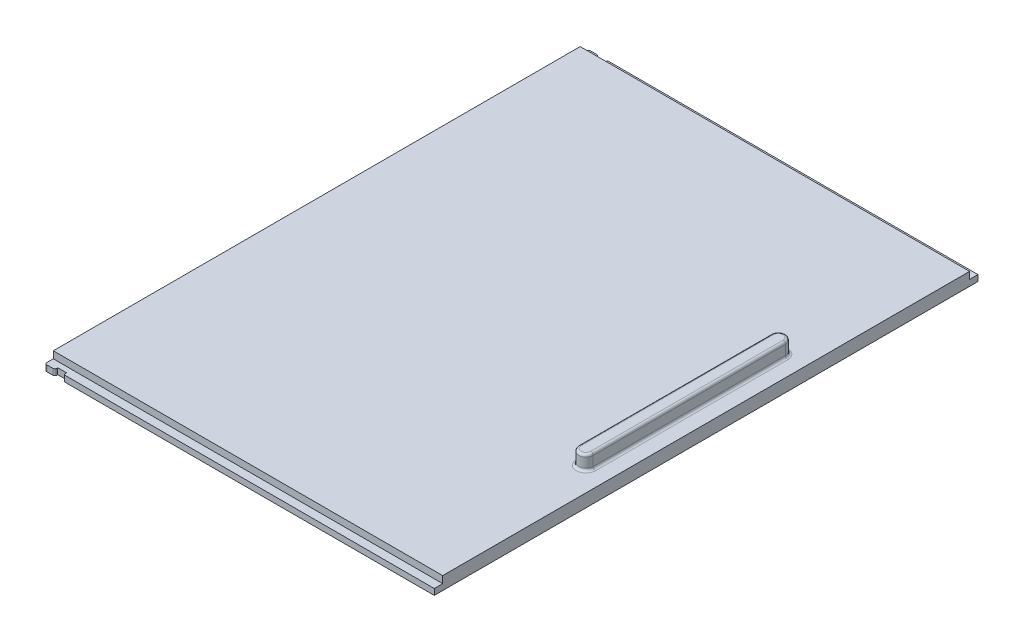
ISO-10303-21;
HEADER;
FILE_DESCRIPTION(('STEP AP214'),'2;1');
FILE_NAME('part.step','',(''),(''),'','','');
FILE_SCHEMA(('AUTOMOTIVE_DESIGN { 1 0 10303 214 1 1 1 1 }'));
ENDSEC;
DATA;
#1=APPLICATION_CONTEXT('core data for automotive mechanical design processes');
#2=APPLICATION_PROTOCOL_DEFINITION('international standard','automotive_design',2000,#1);
#3=PRODUCT_CONTEXT('',#1,'mechanical');
#4=PRODUCT('Part','Part','',(#3));
#5=PRODUCT_RELATED_PRODUCT_CATEGORY('part','',(#4));
#6=PRODUCT_DEFINITION_FORMATION('','',#4);
#7=PRODUCT_DEFINITION_CONTEXT('part definition',#1,'design');
#8=PRODUCT_DEFINITION('design','',#6,#7);
#9=PRODUCT_DEFINITION_SHAPE('','',#8);
#10=(LENGTH_UNIT() NAMED_UNIT(*) SI_UNIT(.MILLI.,.METRE.));
#11=(NAMED_UNIT(*) PLANE_ANGLE_UNIT() SI_UNIT($,.RADIAN.));
#12=(NAMED_UNIT(*) SI_UNIT($,.STERADIAN.) SOLID_ANGLE_UNIT());
#13=UNCERTAINTY_MEASURE_WITH_UNIT(LENGTH_MEASURE(1.E-05),#10,'distance_accuracy_value','');
#14=(GEOMETRIC_REPRESENTATION_CONTEXT(3) GLOBAL_UNCERTAINTY_ASSIGNED_CONTEXT((#13)) GLOBAL_UNIT_ASSIGNED_CONTEXT((#10,
#11,#12)) REPRESENTATION_CONTEXT('',''));
#15=CARTESIAN_POINT('',(0.,0.,0.));
#16=DIRECTION('',(0.,0.,1.));
#17=DIRECTION('',(1.,0.,0.));
#18=AXIS2_PLACEMENT_3D('',#15,#16,#17);
#19=CARTESIAN_POINT('',(0.,3.,0.));
#20=DIRECTION('',(0.,-1.,0.));
#21=DIRECTION('',(0.,0.,-1.));
#22=AXIS2_PLACEMENT_3D('',#19,#20,#21);
#23=PLANE('',#22);
#24=CARTESIAN_POINT('',(76.,3.,-38.));
#25=DIRECTION('',(0.,-1.,0.));
#26=DIRECTION('',(0.,0.,-1.));
#27=AXIS2_PLACEMENT_3D('',#24,#25,#26);
#28=CIRCLE('',#27,2.);
#29=CARTESIAN_POINT('',(78.,3.,-38.));
#30=VERTEX_POINT('',#29);
#31=CARTESIAN_POINT('',(74.,3.,-38.));
#32=VERTEX_POINT('',#31);
#33=EDGE_CURVE('E335',#30,#32,#28,.T.);
#34=ORIENTED_EDGE('',*,*,#33,.T.);
#35=DIRECTION('',(0.,0.,1.));
#36=VECTOR('',#35,1.);
#37=CARTESIAN_POINT('',(74.,3.,-78.));
#38=LINE('',#37,#36);
#39=CARTESIAN_POINT('',(74.,3.,-78.));
#40=VERTEX_POINT('',#39);
#41=EDGE_CURVE('E341',#32,#40,#38,.F.);
#42=ORIENTED_EDGE('',*,*,#41,.T.);
#43=CARTESIAN_POINT('',(76.,3.,-78.));
#44=DIRECTION('',(0.,-1.,0.));
#45=DIRECTION('',(0.,0.,-1.));
#46=AXIS2_PLACEMENT_3D('',#43,#44,#45);
#47=CIRCLE('',#46,2.);
#48=CARTESIAN_POINT('',(78.,3.,-78.));
#49=VERTEX_POINT('',#48);
#50=EDGE_CURVE('E339',#40,#49,#47,.T.);
#51=ORIENTED_EDGE('',*,*,#50,.T.);
#52=DIRECTION('',(0.,0.,-1.));
#53=VECTOR('',#52,1.);
#54=CARTESIAN_POINT('',(78.,3.,-38.));
#55=LINE('',#54,#53);
#56=EDGE_CURVE('E337',#49,#30,#55,.F.);
#57=ORIENTED_EDGE('',*,*,#56,.T.);
#58=EDGE_LOOP('',(#34,#42,#51,#57));
#59=FACE_BOUND('',#58,.T.);
#60=DIRECTION('',(0.,0.,1.));
#61=VECTOR('',#60,1.);
#62=CARTESIAN_POINT('',(0.,3.,0.));
#63=LINE('',#62,#61);
#64=CARTESIAN_POINT('',(0.,3.00000000000001,-112.8));
#65=VERTEX_POINT('',#64);
#66=CARTESIAN_POINT('',(0.,3.,-3.2));
#67=VERTEX_POINT('',#66);
#68=EDGE_CURVE('E279',#65,#67,#63,.T.);
#69=ORIENTED_EDGE('',*,*,#68,.T.);
#70=DIRECTION('',(1.,0.,0.));
#71=VECTOR('',#70,1.);
#72=CARTESIAN_POINT('',(-3.57805813256298,3.,-3.2));
#73=LINE('',#72,#71);
#74=CARTESIAN_POINT('',(81.,3.,-3.2));
#75=VERTEX_POINT('',#74);
#76=EDGE_CURVE('E440',#67,#75,#73,.T.);
#77=ORIENTED_EDGE('',*,*,#76,.T.);
#78=DIRECTION('',(0.,0.,-1.));
#79=VECTOR('',#78,1.);
#80=CARTESIAN_POINT('',(81.,3.,0.));
#81=LINE('',#80,#79);
#82=CARTESIAN_POINT('',(81.,3.00000000000001,-112.8));
#83=VERTEX_POINT('',#82);
#84=EDGE_CURVE('E282',#75,#83,#81,.T.);
#85=ORIENTED_EDGE('',*,*,#84,.T.);
#86=DIRECTION('',(1.,0.,0.));
#87=VECTOR('',#86,1.);
#88=CARTESIAN_POINT('',(-3.57805813256298,3.00000000000001,-112.8));
#89=LINE('',#88,#87);
#90=EDGE_CURVE('E262',#65,#83,#89,.T.);
#91=ORIENTED_EDGE('',*,*,#90,.F.);
#92=EDGE_LOOP('',(#69,#77,#85,#91));
#93=FACE_BOUND('',#92,.T.);
#94=ADVANCED_FACE('F41',(#59,#93),#23,.F.);
#95=CARTESIAN_POINT('',(-3.57805813256298,0.,-114.55));
#96=DIRECTION('',(0.,0.,1.));
#97=DIRECTION('',(1.,0.,0.));
#98=AXIS2_PLACEMENT_3D('',#95,#96,#97);
#99=PLANE('',#98);
#100=DIRECTION('',(0.,-1.,0.));
#101=VECTOR('',#100,1.);
#102=CARTESIAN_POINT('',(81.,0.,-114.55));
#103=LINE('',#102,#101);
#104=CARTESIAN_POINT('',(81.,1.55000000000001,-114.55));
#105=VERTEX_POINT('',#104);
#106=CARTESIAN_POINT('',(81.,0.3,-114.55));
#107=VERTEX_POINT('',#106);
#108=EDGE_CURVE('E253',#105,#107,#103,.T.);
#109=ORIENTED_EDGE('',*,*,#108,.T.);
#110=DIRECTION('',(1.,0.,0.));
#111=VECTOR('',#110,1.);
#112=CARTESIAN_POINT('',(-113.100044208656,0.3,-114.55));
#113=LINE('',#112,#111);
#114=CARTESIAN_POINT('',(4.12500000000002,0.3,-114.55));
#115=VERTEX_POINT('',#114);
#116=EDGE_CURVE('E236',#115,#107,#113,.T.);
#117=ORIENTED_EDGE('',*,*,#116,.F.);
#118=DIRECTION('',(0.,1.,0.));
#119=VECTOR('',#118,1.);
#120=CARTESIAN_POINT('',(4.12500000000003,0.,-114.55));
#121=LINE('',#120,#119);
#122=CARTESIAN_POINT('',(4.12500000000003,1.55000000000001,-114.55));
#123=VERTEX_POINT('',#122);
#124=EDGE_CURVE('E311',#115,#123,#121,.T.);
#125=ORIENTED_EDGE('',*,*,#124,.T.);
#126=DIRECTION('',(1.,0.,0.));
#127=VECTOR('',#126,1.);
#128=CARTESIAN_POINT('',(-3.57805813256298,1.55000000000001,-114.55));
#129=LINE('',#128,#127);
#130=EDGE_CURVE('E259',#123,#105,#129,.T.);
#131=ORIENTED_EDGE('',*,*,#130,.T.);
#132=EDGE_LOOP('',(#109,#117,#125,#131));
#133=FACE_BOUND('',#132,.T.);
#134=ADVANCED_FACE('F257',(#133),#99,.F.);
#135=CARTESIAN_POINT('',(-3.57805813256298,0.,-1.45));
#136=DIRECTION('',(0.,0.,-1.));
#137=DIRECTION('',(0.,1.,0.));
#138=AXIS2_PLACEMENT_3D('',#135,#136,#137);
#139=PLANE('',#138);
#140=DIRECTION('',(0.,-1.,0.));
#141=VECTOR('',#140,1.);
#142=CARTESIAN_POINT('',(4.12500000000002,0.,-1.45));
#143=LINE('',#142,#141);
#144=CARTESIAN_POINT('',(4.12500000000002,1.55,-1.45));
#145=VERTEX_POINT('',#144);
#146=CARTESIAN_POINT('',(4.12500000000001,0.3,-1.45));
#147=VERTEX_POINT('',#146);
#148=EDGE_CURVE('E297',#145,#147,#143,.T.);
#149=ORIENTED_EDGE('',*,*,#148,.T.);
#150=DIRECTION('',(1.,0.,0.));
#151=VECTOR('',#150,1.);
#152=CARTESIAN_POINT('',(-113.100044208656,0.3,-1.44999999999999));
#153=LINE('',#152,#151);
#154=CARTESIAN_POINT('',(81.,0.3,-1.44999999999999));
#155=VERTEX_POINT('',#154);
#156=EDGE_CURVE('E839',#147,#155,#153,.T.);
#157=ORIENTED_EDGE('',*,*,#156,.T.);
#158=DIRECTION('',(0.,1.,0.));
#159=VECTOR('',#158,1.);
#160=CARTESIAN_POINT('',(81.,0.,-1.45));
#161=LINE('',#160,#159);
#162=CARTESIAN_POINT('',(81.,1.55,-1.45));
#163=VERTEX_POINT('',#162);
#164=EDGE_CURVE('E255',#155,#163,#161,.T.);
#165=ORIENTED_EDGE('',*,*,#164,.T.);
#166=DIRECTION('',(1.,0.,0.));
#167=VECTOR('',#166,1.);
#168=CARTESIAN_POINT('',(-3.57805813256298,1.55,-1.45));
#169=LINE('',#168,#167);
#170=EDGE_CURVE('E448',#145,#163,#169,.T.);
#171=ORIENTED_EDGE('',*,*,#170,.F.);
#172=EDGE_LOOP('',(#149,#157,#165,#171));
#173=FACE_BOUND('',#172,.T.);
#174=ADVANCED_FACE('F534',(#173),#139,.F.);
#175=CARTESIAN_POINT('',(0.,3.,0.));
#176=DIRECTION('',(1.,0.,0.));
#177=DIRECTION('',(0.,0.,-1.));
#178=AXIS2_PLACEMENT_3D('',#175,#176,#177);
#179=PLANE('',#178);
#180=DIRECTION('',(0.,1.,0.));
#181=VECTOR('',#180,1.);
#182=CARTESIAN_POINT('',(0.,3.,-114.15));
#183=LINE('',#182,#181);
#184=CARTESIAN_POINT('',(0.,1.55000000000001,-114.15));
#185=VERTEX_POINT('',#184);
#186=CARTESIAN_POINT('',(0.,0.3,-114.15));
#187=VERTEX_POINT('',#186);
#188=EDGE_CURVE('E321',#185,#187,#183,.F.);
#189=ORIENTED_EDGE('',*,*,#188,.T.);
#190=DIRECTION('',(0.,0.,-1.));
#191=VECTOR('',#190,1.);
#192=CARTESIAN_POINT('',(0.,0.3,-1.44999999999999));
#193=LINE('',#192,#191);
#194=CARTESIAN_POINT('',(0.,0.3,-1.85));
#195=VERTEX_POINT('',#194);
#196=EDGE_CURVE('E837',#195,#187,#193,.T.);
#197=ORIENTED_EDGE('',*,*,#196,.F.);
#198=DIRECTION('',(0.,-1.,0.));
#199=VECTOR('',#198,1.);
#200=CARTESIAN_POINT('',(0.,3.,-1.85));
#201=LINE('',#200,#199);
#202=CARTESIAN_POINT('',(0.,1.55,-1.85));
#203=VERTEX_POINT('',#202);
#204=EDGE_CURVE('E319',#195,#203,#201,.F.);
#205=ORIENTED_EDGE('',*,*,#204,.T.);
#206=DIRECTION('',(0.,0.,1.));
#207=VECTOR('',#206,1.);
#208=CARTESIAN_POINT('',(0.,1.55,-1.45));
#209=LINE('',#208,#207);
#210=CARTESIAN_POINT('',(0.,1.55,-3.2));
#211=VERTEX_POINT('',#210);
#212=EDGE_CURVE('E437',#211,#203,#209,.T.);
#213=ORIENTED_EDGE('',*,*,#212,.F.);
#214=DIRECTION('',(0.,-1.,0.));
#215=VECTOR('',#214,1.);
#216=CARTESIAN_POINT('',(0.,1.55,-3.2));
#217=LINE('',#216,#215);
#218=EDGE_CURVE('E283',#67,#211,#217,.T.);
#219=ORIENTED_EDGE('',*,*,#218,.F.);
#220=ORIENTED_EDGE('',*,*,#68,.F.);
#221=DIRECTION('',(0.,1.,0.));
#222=VECTOR('',#221,1.);
#223=CARTESIAN_POINT('',(0.,1.55000000000001,-112.8));
#224=LINE('',#223,#222);
#225=CARTESIAN_POINT('',(0.,1.55000000000001,-112.8));
#226=VERTEX_POINT('',#225);
#227=EDGE_CURVE('E276',#226,#65,#224,.T.);
#228=ORIENTED_EDGE('',*,*,#227,.F.);
#229=DIRECTION('',(0.,0.,1.));
#230=VECTOR('',#229,1.);
#231=CARTESIAN_POINT('',(0.,1.55000000000001,-114.55));
#232=LINE('',#231,#230);
#233=EDGE_CURVE('E274',#185,#226,#232,.T.);
#234=ORIENTED_EDGE('',*,*,#233,.F.);
#235=EDGE_LOOP('',(#189,#197,#205,#213,#219,#220,#228,#234));
#236=FACE_BOUND('',#235,.T.);
#237=ADVANCED_FACE('F541',(#236),#179,.F.);
#238=CARTESIAN_POINT('',(81.,3.,0.));
#239=DIRECTION('',(-1.,0.,0.));
#240=DIRECTION('',(0.,0.,1.));
#241=AXIS2_PLACEMENT_3D('',#238,#239,#240);
#242=PLANE('',#241);
#243=ORIENTED_EDGE('',*,*,#164,.F.);
#244=DIRECTION('',(0.,0.,1.));
#245=VECTOR('',#244,1.);
#246=CARTESIAN_POINT('',(81.,0.3,-1.44999999999999));
#247=LINE('',#246,#245);
#248=EDGE_CURVE('E239',#107,#155,#247,.T.);
#249=ORIENTED_EDGE('',*,*,#248,.F.);
#250=ORIENTED_EDGE('',*,*,#108,.F.);
#251=DIRECTION('',(0.,0.,-1.));
#252=VECTOR('',#251,1.);
#253=CARTESIAN_POINT('',(81.,1.55000000000001,-114.55));
#254=LINE('',#253,#252);
#255=CARTESIAN_POINT('',(81.,1.55000000000001,-112.8));
#256=VERTEX_POINT('',#255);
#257=EDGE_CURVE('E261',#256,#105,#254,.T.);
#258=ORIENTED_EDGE('',*,*,#257,.F.);
#259=DIRECTION('',(0.,-1.,0.));
#260=VECTOR('',#259,1.);
#261=CARTESIAN_POINT('',(81.,1.55000000000001,-112.8));
#262=LINE('',#261,#260);
#263=EDGE_CURVE('E264',#83,#256,#262,.T.);
#264=ORIENTED_EDGE('',*,*,#263,.F.);
#265=ORIENTED_EDGE('',*,*,#84,.F.);
#266=DIRECTION('',(0.,1.,0.));
#267=VECTOR('',#266,1.);
#268=CARTESIAN_POINT('',(81.,1.55,-3.2));
#269=LINE('',#268,#267);
#270=CARTESIAN_POINT('',(81.,1.55,-3.2));
#271=VERTEX_POINT('',#270);
#272=EDGE_CURVE('E446',#271,#75,#269,.T.);
#273=ORIENTED_EDGE('',*,*,#272,.F.);
#274=DIRECTION('',(0.,0.,-1.));
#275=VECTOR('',#274,1.);
#276=CARTESIAN_POINT('',(81.,1.55,-1.45));
#277=LINE('',#276,#275);
#278=EDGE_CURVE('E443',#163,#271,#277,.T.);
#279=ORIENTED_EDGE('',*,*,#278,.F.);
#280=EDGE_LOOP('',(#243,#249,#250,#258,#264,#265,#273,#279));
#281=FACE_BOUND('',#280,.T.);
#282=ADVANCED_FACE('F251',(#281),#242,.F.);
#283=DIRECTION('',(0.,1.,0.));
#284=VECTOR('',#283,1.);
#285=CARTESIAN_POINT('',(1.675,0.,-114.55));
#286=LINE('',#285,#284);
#287=CARTESIAN_POINT('',(1.675,1.55000000000001,-114.55));
#288=VERTEX_POINT('',#287);
#289=CARTESIAN_POINT('',(1.675,0.3,-114.55));
#290=VERTEX_POINT('',#289);
#291=EDGE_CURVE('E305',#288,#290,#286,.F.);
#292=ORIENTED_EDGE('',*,*,#291,.T.);
#293=CARTESIAN_POINT('',(0.399999999999998,0.3,-114.55));
#294=VERTEX_POINT('',#293);
#295=EDGE_CURVE('E246',#294,#290,#113,.T.);
#296=ORIENTED_EDGE('',*,*,#295,.F.);
#297=DIRECTION('',(0.,1.,0.));
#298=VECTOR('',#297,1.);
#299=CARTESIAN_POINT('',(0.4,0.,-114.55));
#300=LINE('',#299,#298);
#301=CARTESIAN_POINT('',(0.4,1.55000000000001,-114.55));
#302=VERTEX_POINT('',#301);
#303=EDGE_CURVE('E315',#294,#302,#300,.T.);
#304=ORIENTED_EDGE('',*,*,#303,.T.);
#305=EDGE_CURVE('E269',#302,#288,#129,.T.);
#306=ORIENTED_EDGE('',*,*,#305,.T.);
#307=EDGE_LOOP('',(#292,#296,#304,#306));
#308=FACE_BOUND('',#307,.T.);
#309=ADVANCED_FACE('F459',(#308),#99,.F.);
#310=DIRECTION('',(0.,-1.,0.));
#311=VECTOR('',#310,1.);
#312=CARTESIAN_POINT('',(0.4,0.,-1.45));
#313=LINE('',#312,#311);
#314=CARTESIAN_POINT('',(0.4,1.55,-1.45));
#315=VERTEX_POINT('',#314);
#316=CARTESIAN_POINT('',(0.4,0.3,-1.45));
#317=VERTEX_POINT('',#316);
#318=EDGE_CURVE('E324',#315,#317,#313,.T.);
#319=ORIENTED_EDGE('',*,*,#318,.T.);
#320=CARTESIAN_POINT('',(1.675,0.3,-1.44999999999999));
#321=VERTEX_POINT('',#320);
#322=EDGE_CURVE('E55',#317,#321,#153,.T.);
#323=ORIENTED_EDGE('',*,*,#322,.T.);
#324=DIRECTION('',(0.,-1.,0.));
#325=VECTOR('',#324,1.);
#326=CARTESIAN_POINT('',(1.675,0.,-1.45));
#327=LINE('',#326,#325);
#328=CARTESIAN_POINT('',(1.675,1.55,-1.45));
#329=VERTEX_POINT('',#328);
#330=EDGE_CURVE('E289',#321,#329,#327,.F.);
#331=ORIENTED_EDGE('',*,*,#330,.T.);
#332=EDGE_CURVE('E453',#315,#329,#169,.T.);
#333=ORIENTED_EDGE('',*,*,#332,.F.);
#334=EDGE_LOOP('',(#319,#323,#331,#333));
#335=FACE_BOUND('',#334,.T.);
#336=ADVANCED_FACE('F682',(#335),#139,.F.);
#337=CARTESIAN_POINT('',(3.925,0.,-2.05));
#338=DIRECTION('',(1.,0.,0.));
#339=DIRECTION('',(0.,0.,-1.));
#340=AXIS2_PLACEMENT_3D('',#337,#338,#339);
#341=PLANE('',#340);
#342=DIRECTION('',(0.,1.,0.));
#343=VECTOR('',#342,1.);
#344=CARTESIAN_POINT('',(3.925,0.,-2.05));
#345=LINE('',#344,#343);
#346=CARTESIAN_POINT('',(3.925,0.3,-2.05));
#347=VERTEX_POINT('',#346);
#348=CARTESIAN_POINT('',(3.925,1.55,-2.05));
#349=VERTEX_POINT('',#348);
#350=EDGE_CURVE('E422',#347,#349,#345,.T.);
#351=ORIENTED_EDGE('',*,*,#350,.F.);
#352=DIRECTION('',(0.,0.,1.));
#353=VECTOR('',#352,1.);
#354=CARTESIAN_POINT('',(3.925,0.3,-2.05));
#355=LINE('',#354,#353);
#356=CARTESIAN_POINT('',(3.925,0.3,-1.65000000000001));
#357=VERTEX_POINT('',#356);
#358=EDGE_CURVE('E477',#347,#357,#355,.T.);
#359=ORIENTED_EDGE('',*,*,#358,.T.);
#360=DIRECTION('',(0.,1.,0.));
#361=VECTOR('',#360,1.);
#362=CARTESIAN_POINT('',(3.925,0.,-1.65000000000001));
#363=LINE('',#362,#361);
#364=CARTESIAN_POINT('',(3.925,1.55,-1.65000000000001));
#365=VERTEX_POINT('',#364);
#366=EDGE_CURVE('E293',#357,#365,#363,.T.);
#367=ORIENTED_EDGE('',*,*,#366,.T.);
#368=DIRECTION('',(0.,0.,1.));
#369=VECTOR('',#368,1.);
#370=CARTESIAN_POINT('',(3.925,1.55,-2.05));
#371=LINE('',#370,#369);
#372=EDGE_CURVE('E432',#349,#365,#371,.T.);
#373=ORIENTED_EDGE('',*,*,#372,.F.);
#374=EDGE_LOOP('',(#351,#359,#367,#373));
#375=FACE_BOUND('',#374,.T.);
#376=ADVANCED_FACE('F706',(#375),#341,.F.);
#377=CARTESIAN_POINT('',(2.075,0.,-2.05));
#378=DIRECTION('',(-1.,0.,0.));
#379=DIRECTION('',(0.,0.,1.));
#380=AXIS2_PLACEMENT_3D('',#377,#378,#379);
#381=PLANE('',#380);
#382=DIRECTION('',(0.,-1.,0.));
#383=VECTOR('',#382,1.);
#384=CARTESIAN_POINT('',(2.075,0.,-1.85));
#385=LINE('',#384,#383);
#386=CARTESIAN_POINT('',(2.075,1.55,-1.85));
#387=VERTEX_POINT('',#386);
#388=CARTESIAN_POINT('',(2.075,0.3,-1.85));
#389=VERTEX_POINT('',#388);
#390=EDGE_CURVE('E286',#387,#389,#385,.T.);
#391=ORIENTED_EDGE('',*,*,#390,.T.);
#392=DIRECTION('',(0.,0.,-1.));
#393=VECTOR('',#392,1.);
#394=CARTESIAN_POINT('',(2.075,0.3,-2.05));
#395=LINE('',#394,#393);
#396=CARTESIAN_POINT('',(2.075,0.3,-2.05));
#397=VERTEX_POINT('',#396);
#398=EDGE_CURVE('E488',#389,#397,#395,.T.);
#399=ORIENTED_EDGE('',*,*,#398,.T.);
#400=DIRECTION('',(0.,-1.,0.));
#401=VECTOR('',#400,1.);
#402=CARTESIAN_POINT('',(2.075,0.,-2.05));
#403=LINE('',#402,#401);
#404=CARTESIAN_POINT('',(2.075,1.55,-2.05));
#405=VERTEX_POINT('',#404);
#406=EDGE_CURVE('E429',#405,#397,#403,.T.);
#407=ORIENTED_EDGE('',*,*,#406,.F.);
#408=DIRECTION('',(0.,0.,1.));
#409=VECTOR('',#408,1.);
#410=CARTESIAN_POINT('',(2.075,1.55,-2.05));
#411=LINE('',#410,#409);
#412=EDGE_CURVE('E277',#405,#387,#411,.T.);
#413=ORIENTED_EDGE('',*,*,#412,.T.);
#414=EDGE_LOOP('',(#391,#399,#407,#413));
#415=FACE_BOUND('',#414,.T.);
#416=ADVANCED_FACE('F714',(#415),#381,.F.);
#417=CARTESIAN_POINT('',(0.,0.,-2.05));
#418=DIRECTION('',(0.,0.,-1.));
#419=DIRECTION('',(-1.,0.,0.));
#420=AXIS2_PLACEMENT_3D('',#417,#418,#419);
#421=PLANE('',#420);
#422=ORIENTED_EDGE('',*,*,#406,.T.);
#423=DIRECTION('',(1.,0.,0.));
#424=VECTOR('',#423,1.);
#425=CARTESIAN_POINT('',(0.,0.3,-2.05));
#426=LINE('',#425,#424);
#427=EDGE_CURVE('E485',#397,#347,#426,.T.);
#428=ORIENTED_EDGE('',*,*,#427,.T.);
#429=ORIENTED_EDGE('',*,*,#350,.T.);
#430=DIRECTION('',(-1.,0.,0.));
#431=VECTOR('',#430,1.);
#432=CARTESIAN_POINT('',(2.075,1.55,-2.05));
#433=LINE('',#432,#431);
#434=EDGE_CURVE('E426',#349,#405,#433,.T.);
#435=ORIENTED_EDGE('',*,*,#434,.T.);
#436=EDGE_LOOP('',(#422,#428,#429,#435));
#437=FACE_BOUND('',#436,.T.);
#438=ADVANCED_FACE('F549',(#437),#421,.F.);
#439=CARTESIAN_POINT('',(1.675,0.,-1.85));
#440=DIRECTION('',(0.,-1.,0.));
#441=DIRECTION('',(0.,0.,-1.));
#442=AXIS2_PLACEMENT_3D('',#439,#440,#441);
#443=CYLINDRICAL_SURFACE('',#442,0.4);
#444=CARTESIAN_POINT('',(1.675,0.3,-1.85));
#445=DIRECTION('',(0.,1.,0.));
#446=DIRECTION('',(0.,0.,1.));
#447=AXIS2_PLACEMENT_3D('',#444,#445,#446);
#448=CIRCLE('',#447,0.4);
#449=EDGE_CURVE('E377',#389,#321,#448,.F.);
#450=ORIENTED_EDGE('',*,*,#449,.F.);
#451=ORIENTED_EDGE('',*,*,#390,.F.);
#452=CARTESIAN_POINT('',(1.675,1.55,-1.85));
#453=DIRECTION('',(0.,-1.,0.));
#454=DIRECTION('',(0.,0.,-1.));
#455=AXIS2_PLACEMENT_3D('',#452,#453,#454);
#456=CIRCLE('',#455,0.4);
#457=EDGE_CURVE('E291',#329,#387,#456,.F.);
#458=ORIENTED_EDGE('',*,*,#457,.F.);
#459=ORIENTED_EDGE('',*,*,#330,.F.);
#460=EDGE_LOOP('',(#450,#451,#458,#459));
#461=FACE_BOUND('',#460,.T.);
#462=ADVANCED_FACE('F545',(#461),#443,.T.);
#463=CARTESIAN_POINT('',(3.925,0.,-1.65000000000001));
#464=DIRECTION('',(0.707106781186523,0.,-0.707106781186572));
#465=DIRECTION('',(0.,1.,0.));
#466=AXIS2_PLACEMENT_3D('',#463,#464,#465);
#467=PLANE('',#466);
#468=DIRECTION('',(0.707106781186572,0.,0.707106781186523));
#469=VECTOR('',#468,1.);
#470=CARTESIAN_POINT('',(3.925,0.3,-1.65000000000001));
#471=LINE('',#470,#469);
#472=EDGE_CURVE('E474',#147,#357,#471,.F.);
#473=ORIENTED_EDGE('',*,*,#472,.F.);
#474=ORIENTED_EDGE('',*,*,#148,.F.);
#475=DIRECTION('',(-0.707106781186572,0.,-0.707106781186523));
#476=VECTOR('',#475,1.);
#477=CARTESIAN_POINT('',(3.925,1.55,-1.65000000000001));
#478=LINE('',#477,#476);
#479=EDGE_CURVE('E295',#365,#145,#478,.F.);
#480=ORIENTED_EDGE('',*,*,#479,.F.);
#481=ORIENTED_EDGE('',*,*,#366,.F.);
#482=EDGE_LOOP('',(#473,#474,#480,#481));
#483=FACE_BOUND('',#482,.T.);
#484=ADVANCED_FACE('F548',(#483),#467,.F.);
#485=CARTESIAN_POINT('',(3.925,1.55000000000001,-113.95));
#486=DIRECTION('',(1.,0.,0.));
#487=DIRECTION('',(0.,0.,-1.));
#488=AXIS2_PLACEMENT_3D('',#485,#486,#487);
#489=PLANE('',#488);
#490=DIRECTION('',(0.,-1.,0.));
#491=VECTOR('',#490,1.);
#492=CARTESIAN_POINT('',(3.925,1.55000000000001,-114.35));
#493=LINE('',#492,#491);
#494=CARTESIAN_POINT('',(3.925,1.55000000000001,-114.35));
#495=VERTEX_POINT('',#494);
#496=CARTESIAN_POINT('',(3.925,0.3,-114.35));
#497=VERTEX_POINT('',#496);
#498=EDGE_CURVE('E308',#495,#497,#493,.T.);
#499=ORIENTED_EDGE('',*,*,#498,.T.);
#500=DIRECTION('',(0.,0.,1.));
#501=VECTOR('',#500,1.);
#502=CARTESIAN_POINT('',(3.925,0.3,-113.95));
#503=LINE('',#502,#501);
#504=CARTESIAN_POINT('',(3.925,0.3,-113.95));
#505=VERTEX_POINT('',#504);
#506=EDGE_CURVE('E830',#497,#505,#503,.T.);
#507=ORIENTED_EDGE('',*,*,#506,.T.);
#508=DIRECTION('',(0.,-1.,0.));
#509=VECTOR('',#508,1.);
#510=CARTESIAN_POINT('',(3.925,1.55000000000001,-113.95));
#511=LINE('',#510,#509);
#512=CARTESIAN_POINT('',(3.925,1.55000000000001,-113.95));
#513=VERTEX_POINT('',#512);
#514=EDGE_CURVE('E405',#513,#505,#511,.T.);
#515=ORIENTED_EDGE('',*,*,#514,.F.);
#516=DIRECTION('',(0.,0.,-1.));
#517=VECTOR('',#516,1.);
#518=CARTESIAN_POINT('',(3.925,1.55000000000001,-113.95));
#519=LINE('',#518,#517);
#520=EDGE_CURVE('E419',#513,#495,#519,.T.);
#521=ORIENTED_EDGE('',*,*,#520,.T.);
#522=EDGE_LOOP('',(#499,#507,#515,#521));
#523=FACE_BOUND('',#522,.T.);
#524=ADVANCED_FACE('F557',(#523),#489,.F.);
#525=CARTESIAN_POINT('',(2.075,1.55000000000001,-113.95));
#526=DIRECTION('',(-1.,0.,0.));
#527=DIRECTION('',(0.,0.,1.));
#528=AXIS2_PLACEMENT_3D('',#525,#526,#527);
#529=PLANE('',#528);
#530=DIRECTION('',(0.,1.,0.));
#531=VECTOR('',#530,1.);
#532=CARTESIAN_POINT('',(2.075,1.55000000000001,-113.95));
#533=LINE('',#532,#531);
#534=CARTESIAN_POINT('',(2.075,0.3,-113.95));
#535=VERTEX_POINT('',#534);
#536=CARTESIAN_POINT('',(2.075,1.55000000000001,-113.95));
#537=VERTEX_POINT('',#536);
#538=EDGE_CURVE('E408',#535,#537,#533,.T.);
#539=ORIENTED_EDGE('',*,*,#538,.F.);
#540=DIRECTION('',(0.,0.,-1.));
#541=VECTOR('',#540,1.);
#542=CARTESIAN_POINT('',(2.075,0.3,-113.95));
#543=LINE('',#542,#541);
#544=CARTESIAN_POINT('',(2.075,0.3,-114.15));
#545=VERTEX_POINT('',#544);
#546=EDGE_CURVE('E475',#535,#545,#543,.T.);
#547=ORIENTED_EDGE('',*,*,#546,.T.);
#548=DIRECTION('',(0.,1.,0.));
#549=VECTOR('',#548,1.);
#550=CARTESIAN_POINT('',(2.075,1.55000000000001,-114.15));
#551=LINE('',#550,#549);
#552=CARTESIAN_POINT('',(2.075,1.55000000000001,-114.15));
#553=VERTEX_POINT('',#552);
#554=EDGE_CURVE('E300',#545,#553,#551,.T.);
#555=ORIENTED_EDGE('',*,*,#554,.T.);
#556=DIRECTION('',(0.,0.,-1.));
#557=VECTOR('',#556,1.);
#558=CARTESIAN_POINT('',(2.075,1.55000000000001,-113.95));
#559=LINE('',#558,#557);
#560=EDGE_CURVE('E418',#537,#553,#559,.T.);
#561=ORIENTED_EDGE('',*,*,#560,.F.);
#562=EDGE_LOOP('',(#539,#547,#555,#561));
#563=FACE_BOUND('',#562,.T.);
#564=ADVANCED_FACE('F749',(#563),#529,.F.);
#565=CARTESIAN_POINT('',(0.,0.,-113.95));
#566=DIRECTION('',(0.,0.,1.));
#567=DIRECTION('',(1.,0.,0.));
#568=AXIS2_PLACEMENT_3D('',#565,#566,#567);
#569=PLANE('',#568);
#570=ORIENTED_EDGE('',*,*,#514,.T.);
#571=DIRECTION('',(-1.,0.,0.));
#572=VECTOR('',#571,1.);
#573=CARTESIAN_POINT('',(0.,0.3,-113.95));
#574=LINE('',#573,#572);
#575=EDGE_CURVE('E479',#505,#535,#574,.T.);
#576=ORIENTED_EDGE('',*,*,#575,.T.);
#577=ORIENTED_EDGE('',*,*,#538,.T.);
#578=DIRECTION('',(1.,0.,0.));
#579=VECTOR('',#578,1.);
#580=CARTESIAN_POINT('',(2.075,1.55000000000001,-113.95));
#581=LINE('',#580,#579);
#582=EDGE_CURVE('E415',#537,#513,#581,.T.);
#583=ORIENTED_EDGE('',*,*,#582,.T.);
#584=EDGE_LOOP('',(#570,#576,#577,#583));
#585=FACE_BOUND('',#584,.T.);
#586=ADVANCED_FACE('F562',(#585),#569,.F.);
#587=CARTESIAN_POINT('',(1.675,1.55000000000001,-114.15));
#588=DIRECTION('',(0.,1.,0.));
#589=DIRECTION('',(0.,0.,1.));
#590=AXIS2_PLACEMENT_3D('',#587,#588,#589);
#591=CYLINDRICAL_SURFACE('',#590,0.4);
#592=CARTESIAN_POINT('',(1.675,0.3,-114.15));
#593=DIRECTION('',(0.,1.,0.));
#594=DIRECTION('',(0.,0.,1.));
#595=AXIS2_PLACEMENT_3D('',#592,#593,#594);
#596=CIRCLE('',#595,0.4);
#597=EDGE_CURVE('E472',#290,#545,#596,.F.);
#598=ORIENTED_EDGE('',*,*,#597,.F.);
#599=ORIENTED_EDGE('',*,*,#291,.F.);
#600=CARTESIAN_POINT('',(1.675,1.55000000000001,-114.15));
#601=DIRECTION('',(0.,-1.,0.));
#602=DIRECTION('',(0.,0.,-1.));
#603=AXIS2_PLACEMENT_3D('',#600,#601,#602);
#604=CIRCLE('',#603,0.4);
#605=EDGE_CURVE('E302',#553,#288,#604,.F.);
#606=ORIENTED_EDGE('',*,*,#605,.F.);
#607=ORIENTED_EDGE('',*,*,#554,.F.);
#608=EDGE_LOOP('',(#598,#599,#606,#607));
#609=FACE_BOUND('',#608,.T.);
#610=ADVANCED_FACE('F471',(#609),#591,.T.);
#611=CARTESIAN_POINT('',(3.925,1.55000000000001,-114.35));
#612=DIRECTION('',(0.707106781186548,0.,0.707106781186548));
#613=DIRECTION('',(0.,-1.,0.));
#614=AXIS2_PLACEMENT_3D('',#611,#612,#613);
#615=PLANE('',#614);
#616=DIRECTION('',(-0.707106781186548,0.,0.707106781186548));
#617=VECTOR('',#616,1.);
#618=CARTESIAN_POINT('',(3.925,0.3,-114.35));
#619=LINE('',#618,#617);
#620=EDGE_CURVE('E242',#497,#115,#619,.F.);
#621=ORIENTED_EDGE('',*,*,#620,.F.);
#622=ORIENTED_EDGE('',*,*,#498,.F.);
#623=DIRECTION('',(0.707106781186548,0.,-0.707106781186548));
#624=VECTOR('',#623,1.);
#625=CARTESIAN_POINT('',(3.925,1.55000000000001,-114.35));
#626=LINE('',#625,#624);
#627=EDGE_CURVE('E313',#123,#495,#626,.F.);
#628=ORIENTED_EDGE('',*,*,#627,.F.);
#629=ORIENTED_EDGE('',*,*,#124,.F.);
#630=EDGE_LOOP('',(#621,#622,#628,#629));
#631=FACE_BOUND('',#630,.T.);
#632=ADVANCED_FACE('F561',(#631),#615,.F.);
#633=CARTESIAN_POINT('',(-3.57805813256298,1.55000000000001,-114.55));
#634=DIRECTION('',(0.,-1.,0.));
#635=DIRECTION('',(0.,0.,-1.));
#636=AXIS2_PLACEMENT_3D('',#633,#634,#635);
#637=PLANE('',#636);
#638=ORIENTED_EDGE('',*,*,#305,.F.);
#639=CARTESIAN_POINT('',(0.4,1.55000000000001,-114.15));
#640=DIRECTION('',(0.,-1.,0.));
#641=DIRECTION('',(0.,0.,-1.));
#642=AXIS2_PLACEMENT_3D('',#639,#640,#641);
#643=CIRCLE('',#642,0.4);
#644=EDGE_CURVE('E317',#302,#185,#643,.F.);
#645=ORIENTED_EDGE('',*,*,#644,.T.);
#646=ORIENTED_EDGE('',*,*,#233,.T.);
#647=DIRECTION('',(1.,0.,0.));
#648=VECTOR('',#647,1.);
#649=CARTESIAN_POINT('',(-3.57805813256298,1.55000000000001,-112.8));
#650=LINE('',#649,#648);
#651=EDGE_CURVE('E266',#226,#256,#650,.T.);
#652=ORIENTED_EDGE('',*,*,#651,.T.);
#653=ORIENTED_EDGE('',*,*,#257,.T.);
#654=ORIENTED_EDGE('',*,*,#130,.F.);
#655=ORIENTED_EDGE('',*,*,#627,.T.);
#656=ORIENTED_EDGE('',*,*,#520,.F.);
#657=ORIENTED_EDGE('',*,*,#582,.F.);
#658=ORIENTED_EDGE('',*,*,#560,.T.);
#659=ORIENTED_EDGE('',*,*,#605,.T.);
#660=EDGE_LOOP('',(#638,#645,#646,#652,#653,#654,#655,#656,#657,#658,#659));
#661=FACE_BOUND('',#660,.T.);
#662=ADVANCED_FACE('F465',(#661),#637,.F.);
#663=CARTESIAN_POINT('',(-3.57805813256298,1.55000000000001,-112.8));
#664=DIRECTION('',(0.,0.,1.));
#665=DIRECTION('',(1.,0.,0.));
#666=AXIS2_PLACEMENT_3D('',#663,#664,#665);
#667=PLANE('',#666);
#668=ORIENTED_EDGE('',*,*,#227,.T.);
#669=ORIENTED_EDGE('',*,*,#90,.T.);
#670=ORIENTED_EDGE('',*,*,#263,.T.);
#671=ORIENTED_EDGE('',*,*,#651,.F.);
#672=EDGE_LOOP('',(#668,#669,#670,#671));
#673=FACE_BOUND('',#672,.T.);
#674=ADVANCED_FACE('F794',(#673),#667,.F.);
#675=CARTESIAN_POINT('',(-3.57805813256298,1.55,-3.2));
#676=DIRECTION('',(0.,0.,-1.));
#677=DIRECTION('',(-1.,0.,0.));
#678=AXIS2_PLACEMENT_3D('',#675,#676,#677);
#679=PLANE('',#678);
#680=ORIENTED_EDGE('',*,*,#218,.T.);
#681=DIRECTION('',(1.,0.,0.));
#682=VECTOR('',#681,1.);
#683=CARTESIAN_POINT('',(-3.57805813256298,1.55,-3.2));
#684=LINE('',#683,#682);
#685=EDGE_CURVE('E451',#211,#271,#684,.T.);
#686=ORIENTED_EDGE('',*,*,#685,.T.);
#687=ORIENTED_EDGE('',*,*,#272,.T.);
#688=ORIENTED_EDGE('',*,*,#76,.F.);
#689=EDGE_LOOP('',(#680,#686,#687,#688));
#690=FACE_BOUND('',#689,.T.);
#691=ADVANCED_FACE('F783',(#690),#679,.F.);
#692=CARTESIAN_POINT('',(-3.57805813256298,1.55,-1.45));
#693=DIRECTION('',(0.,-1.,0.));
#694=DIRECTION('',(0.,0.,-1.));
#695=AXIS2_PLACEMENT_3D('',#692,#693,#694);
#696=PLANE('',#695);
#697=ORIENTED_EDGE('',*,*,#212,.T.);
#698=CARTESIAN_POINT('',(0.4,1.55,-1.85));
#699=DIRECTION('',(0.,-1.,0.));
#700=DIRECTION('',(0.,0.,-1.));
#701=AXIS2_PLACEMENT_3D('',#698,#699,#700);
#702=CIRCLE('',#701,0.4);
#703=EDGE_CURVE('E327',#203,#315,#702,.F.);
#704=ORIENTED_EDGE('',*,*,#703,.T.);
#705=ORIENTED_EDGE('',*,*,#332,.T.);
#706=ORIENTED_EDGE('',*,*,#457,.T.);
#707=ORIENTED_EDGE('',*,*,#412,.F.);
#708=ORIENTED_EDGE('',*,*,#434,.F.);
#709=ORIENTED_EDGE('',*,*,#372,.T.);
#710=ORIENTED_EDGE('',*,*,#479,.T.);
#711=ORIENTED_EDGE('',*,*,#170,.T.);
#712=ORIENTED_EDGE('',*,*,#278,.T.);
#713=ORIENTED_EDGE('',*,*,#685,.F.);
#714=EDGE_LOOP('',(#697,#704,#705,#706,#707,#708,#709,#710,#711,#712,#713));
#715=FACE_BOUND('',#714,.T.);
#716=ADVANCED_FACE('F572',(#715),#696,.F.);
#717=CARTESIAN_POINT('',(0.4,0.,-114.15));
#718=DIRECTION('',(0.,1.,0.));
#719=DIRECTION('',(0.,0.,1.));
#720=AXIS2_PLACEMENT_3D('',#717,#718,#719);
#721=CYLINDRICAL_SURFACE('',#720,0.4);
#722=CARTESIAN_POINT('',(0.4,0.3,-114.15));
#723=DIRECTION('',(0.,1.,0.));
#724=DIRECTION('',(0.,0.,1.));
#725=AXIS2_PLACEMENT_3D('',#722,#723,#724);
#726=CIRCLE('',#725,0.4);
#727=EDGE_CURVE('E836',#187,#294,#726,.F.);
#728=ORIENTED_EDGE('',*,*,#727,.F.);
#729=ORIENTED_EDGE('',*,*,#188,.F.);
#730=ORIENTED_EDGE('',*,*,#644,.F.);
#731=ORIENTED_EDGE('',*,*,#303,.F.);
#732=EDGE_LOOP('',(#728,#729,#730,#731));
#733=FACE_BOUND('',#732,.T.);
#734=ADVANCED_FACE('F568',(#733),#721,.T.);
#735=CARTESIAN_POINT('',(0.4,0.,-1.85));
#736=DIRECTION('',(0.,-1.,0.));
#737=DIRECTION('',(0.,0.,-1.));
#738=AXIS2_PLACEMENT_3D('',#735,#736,#737);
#739=CYLINDRICAL_SURFACE('',#738,0.4);
#740=CARTESIAN_POINT('',(0.4,0.3,-1.85));
#741=DIRECTION('',(0.,1.,0.));
#742=DIRECTION('',(0.,0.,1.));
#743=AXIS2_PLACEMENT_3D('',#740,#741,#742);
#744=CIRCLE('',#743,0.4);
#745=EDGE_CURVE('E11',#317,#195,#744,.F.);
#746=ORIENTED_EDGE('',*,*,#745,.F.);
#747=ORIENTED_EDGE('',*,*,#318,.F.);
#748=ORIENTED_EDGE('',*,*,#703,.F.);
#749=ORIENTED_EDGE('',*,*,#204,.F.);
#750=EDGE_LOOP('',(#746,#747,#748,#749));
#751=FACE_BOUND('',#750,.T.);
#752=ADVANCED_FACE('F571',(#751),#739,.T.);
#753=CARTESIAN_POINT('',(76.,6.,-38.));
#754=DIRECTION('',(0.,-1.,0.));
#755=DIRECTION('',(0.,0.,-1.));
#756=AXIS2_PLACEMENT_3D('',#753,#754,#755);
#757=CYLINDRICAL_SURFACE('',#756,1.5);
#758=DIRECTION('',(0.,-1.,0.));
#759=VECTOR('',#758,1.);
#760=CARTESIAN_POINT('',(77.5,6.,-38.));
#761=LINE('',#760,#759);
#762=CARTESIAN_POINT('',(77.5,5.5,-38.));
#763=VERTEX_POINT('',#762);
#764=CARTESIAN_POINT('',(77.5,3.5,-38.));
#765=VERTEX_POINT('',#764);
#766=EDGE_CURVE('E396',#763,#765,#761,.T.);
#767=ORIENTED_EDGE('',*,*,#766,.F.);
#768=CARTESIAN_POINT('',(76.,5.5,-38.));
#769=DIRECTION('',(0.,1.,0.));
#770=DIRECTION('',(0.,0.,1.));
#771=AXIS2_PLACEMENT_3D('',#768,#769,#770);
#772=CIRCLE('',#771,1.5);
#773=CARTESIAN_POINT('',(74.5,5.5,-38.));
#774=VERTEX_POINT('',#773);
#775=EDGE_CURVE('E49',#763,#774,#772,.F.);
#776=ORIENTED_EDGE('',*,*,#775,.T.);
#777=DIRECTION('',(0.,-1.,0.));
#778=VECTOR('',#777,1.);
#779=CARTESIAN_POINT('',(74.5,6.,-38.));
#780=LINE('',#779,#778);
#781=CARTESIAN_POINT('',(74.5,3.5,-38.));
#782=VERTEX_POINT('',#781);
#783=EDGE_CURVE('E373',#774,#782,#780,.T.);
#784=ORIENTED_EDGE('',*,*,#783,.T.);
#785=CARTESIAN_POINT('',(76.,3.5,-38.));
#786=DIRECTION('',(0.,-1.,0.));
#787=DIRECTION('',(0.,0.,-1.));
#788=AXIS2_PLACEMENT_3D('',#785,#786,#787);
#789=CIRCLE('',#788,1.5);
#790=EDGE_CURVE('E359',#782,#765,#789,.F.);
#791=ORIENTED_EDGE('',*,*,#790,.T.);
#792=EDGE_LOOP('',(#767,#776,#784,#791));
#793=FACE_BOUND('',#792,.T.);
#794=ADVANCED_FACE('F401',(#793),#757,.T.);
#795=CARTESIAN_POINT('',(77.5,6.,-38.));
#796=DIRECTION('',(-1.,0.,0.));
#797=DIRECTION('',(0.,0.,1.));
#798=AXIS2_PLACEMENT_3D('',#795,#796,#797);
#799=PLANE('',#798);
#800=ORIENTED_EDGE('',*,*,#766,.T.);
#801=DIRECTION('',(0.,0.,-1.));
#802=VECTOR('',#801,1.);
#803=CARTESIAN_POINT('',(77.5,3.5,-78.));
#804=LINE('',#803,#802);
#805=CARTESIAN_POINT('',(77.5,3.5,-78.));
#806=VERTEX_POINT('',#805);
#807=EDGE_CURVE('E350',#765,#806,#804,.T.);
#808=ORIENTED_EDGE('',*,*,#807,.T.);
#809=DIRECTION('',(0.,-1.,0.));
#810=VECTOR('',#809,1.);
#811=CARTESIAN_POINT('',(77.5,6.,-78.));
#812=LINE('',#811,#810);
#813=CARTESIAN_POINT('',(77.5,5.5,-78.));
#814=VERTEX_POINT('',#813);
#815=EDGE_CURVE('E399',#814,#806,#812,.T.);
#816=ORIENTED_EDGE('',*,*,#815,.F.);
#817=DIRECTION('',(0.,0.,-1.));
#818=VECTOR('',#817,1.);
#819=CARTESIAN_POINT('',(77.5,5.5,-38.));
#820=LINE('',#819,#818);
#821=EDGE_CURVE('E348',#814,#763,#820,.F.);
#822=ORIENTED_EDGE('',*,*,#821,.T.);
#823=EDGE_LOOP('',(#800,#808,#816,#822));
#824=FACE_BOUND('',#823,.T.);
#825=ADVANCED_FACE('F395',(#824),#799,.F.);
#826=CARTESIAN_POINT('',(76.,6.,-78.));
#827=DIRECTION('',(0.,-1.,0.));
#828=DIRECTION('',(0.,0.,-1.));
#829=AXIS2_PLACEMENT_3D('',#826,#827,#828);
#830=CYLINDRICAL_SURFACE('',#829,1.5);
#831=ORIENTED_EDGE('',*,*,#815,.T.);
#832=CARTESIAN_POINT('',(76.,3.5,-78.));
#833=DIRECTION('',(0.,-1.,0.));
#834=DIRECTION('',(0.,0.,-1.));
#835=AXIS2_PLACEMENT_3D('',#832,#833,#834);
#836=CIRCLE('',#835,1.5);
#837=CARTESIAN_POINT('',(74.5,3.5,-78.));
#838=VERTEX_POINT('',#837);
#839=EDGE_CURVE('E346',#806,#838,#836,.F.);
#840=ORIENTED_EDGE('',*,*,#839,.T.);
#841=DIRECTION('',(0.,-1.,0.));
#842=VECTOR('',#841,1.);
#843=CARTESIAN_POINT('',(74.5,6.,-78.));
#844=LINE('',#843,#842);
#845=CARTESIAN_POINT('',(74.5,5.5,-78.));
#846=VERTEX_POINT('',#845);
#847=EDGE_CURVE('E410',#846,#838,#844,.T.);
#848=ORIENTED_EDGE('',*,*,#847,.F.);
#849=CARTESIAN_POINT('',(76.,5.5,-78.));
#850=DIRECTION('',(0.,1.,0.));
#851=DIRECTION('',(0.,0.,1.));
#852=AXIS2_PLACEMENT_3D('',#849,#850,#851);
#853=CIRCLE('',#852,1.5);
#854=EDGE_CURVE('E344',#846,#814,#853,.F.);
#855=ORIENTED_EDGE('',*,*,#854,.T.);
#856=EDGE_LOOP('',(#831,#840,#848,#855));
#857=FACE_BOUND('',#856,.T.);
#858=ADVANCED_FACE('F516',(#857),#830,.T.);
#859=CARTESIAN_POINT('',(74.5,6.,-38.));
#860=DIRECTION('',(1.,0.,0.));
#861=DIRECTION('',(0.,0.,-1.));
#862=AXIS2_PLACEMENT_3D('',#859,#860,#861);
#863=PLANE('',#862);
#864=ORIENTED_EDGE('',*,*,#847,.T.);
#865=DIRECTION('',(0.,0.,1.));
#866=VECTOR('',#865,1.);
#867=CARTESIAN_POINT('',(74.5,3.5,-38.));
#868=LINE('',#867,#866);
#869=EDGE_CURVE('E332',#838,#782,#868,.T.);
#870=ORIENTED_EDGE('',*,*,#869,.T.);
#871=ORIENTED_EDGE('',*,*,#783,.F.);
#872=DIRECTION('',(0.,0.,1.));
#873=VECTOR('',#872,1.);
#874=CARTESIAN_POINT('',(74.5,5.5,-78.));
#875=LINE('',#874,#873);
#876=EDGE_CURVE('E329',#774,#846,#875,.F.);
#877=ORIENTED_EDGE('',*,*,#876,.T.);
#878=EDGE_LOOP('',(#864,#870,#871,#877));
#879=FACE_BOUND('',#878,.T.);
#880=ADVANCED_FACE('F496',(#879),#863,.F.);
#881=CARTESIAN_POINT('',(76.,6.,-38.));
#882=DIRECTION('',(0.,1.,0.));
#883=DIRECTION('',(0.,0.,1.));
#884=AXIS2_PLACEMENT_3D('',#881,#882,#883);
#885=PLANE('',#884);
#886=CARTESIAN_POINT('',(76.,6.,-78.));
#887=DIRECTION('',(0.,1.,0.));
#888=DIRECTION('',(0.,0.,1.));
#889=AXIS2_PLACEMENT_3D('',#886,#887,#888);
#890=CIRCLE('',#889,1.);
#891=CARTESIAN_POINT('',(77.,6.,-78.));
#892=VERTEX_POINT('',#891);
#893=CARTESIAN_POINT('',(75.,6.,-78.));
#894=VERTEX_POINT('',#893);
#895=EDGE_CURVE('E63',#892,#894,#890,.T.);
#896=ORIENTED_EDGE('',*,*,#895,.T.);
#897=DIRECTION('',(0.,0.,1.));
#898=VECTOR('',#897,1.);
#899=CARTESIAN_POINT('',(75.,6.,-38.));
#900=LINE('',#899,#898);
#901=CARTESIAN_POINT('',(75.,6.,-38.));
#902=VERTEX_POINT('',#901);
#903=EDGE_CURVE('E357',#894,#902,#900,.T.);
#904=ORIENTED_EDGE('',*,*,#903,.T.);
#905=CARTESIAN_POINT('',(76.,6.,-38.));
#906=DIRECTION('',(0.,1.,0.));
#907=DIRECTION('',(0.,0.,1.));
#908=AXIS2_PLACEMENT_3D('',#905,#906,#907);
#909=CIRCLE('',#908,1.);
#910=CARTESIAN_POINT('',(77.,6.,-38.));
#911=VERTEX_POINT('',#910);
#912=EDGE_CURVE('E352',#902,#911,#909,.T.);
#913=ORIENTED_EDGE('',*,*,#912,.T.);
#914=DIRECTION('',(0.,0.,-1.));
#915=VECTOR('',#914,1.);
#916=CARTESIAN_POINT('',(77.,6.,-78.));
#917=LINE('',#916,#915);
#918=EDGE_CURVE('E354',#911,#892,#917,.T.);
#919=ORIENTED_EDGE('',*,*,#918,.T.);
#920=EDGE_LOOP('',(#896,#904,#913,#919));
#921=FACE_BOUND('',#920,.T.);
#922=ADVANCED_FACE('F523',(#921),#885,.T.);
#923=CARTESIAN_POINT('',(78.,3.5,-38.));
#924=DIRECTION('',(0.,0.,1.));
#925=DIRECTION('',(1.,0.,0.));
#926=AXIS2_PLACEMENT_3D('',#923,#924,#925);
#927=CYLINDRICAL_SURFACE('',#926,0.5);
#928=CARTESIAN_POINT('',(78.,3.5,-38.));
#929=DIRECTION('',(0.,0.,-1.));
#930=DIRECTION('',(-1.,0.,0.));
#931=AXIS2_PLACEMENT_3D('',#928,#929,#930);
#932=CIRCLE('',#931,0.5);
#933=EDGE_CURVE('E367',#30,#765,#932,.T.);
#934=ORIENTED_EDGE('',*,*,#933,.F.);
#935=ORIENTED_EDGE('',*,*,#56,.F.);
#936=CARTESIAN_POINT('',(78.,3.5,-78.));
#937=DIRECTION('',(0.,0.,1.));
#938=DIRECTION('',(1.,0.,0.));
#939=AXIS2_PLACEMENT_3D('',#936,#937,#938);
#940=CIRCLE('',#939,0.5);
#941=EDGE_CURVE('E370',#806,#49,#940,.T.);
#942=ORIENTED_EDGE('',*,*,#941,.F.);
#943=ORIENTED_EDGE('',*,*,#807,.F.);
#944=EDGE_LOOP('',(#934,#935,#942,#943));
#945=FACE_BOUND('',#944,.T.);
#946=ADVANCED_FACE('F514',(#945),#927,.F.);
#947=CARTESIAN_POINT('',(76.,3.5,-78.));
#948=DIRECTION('',(0.,-1.,0.));
#949=DIRECTION('',(0.,0.,-1.));
#950=AXIS2_PLACEMENT_3D('',#947,#948,#949);
#951=TOROIDAL_SURFACE('',#950,2.,0.5);
#952=ORIENTED_EDGE('',*,*,#941,.T.);
#953=ORIENTED_EDGE('',*,*,#50,.F.);
#954=CARTESIAN_POINT('',(74.,3.5,-78.));
#955=DIRECTION('',(0.,0.,-1.));
#956=DIRECTION('',(-1.,0.,0.));
#957=AXIS2_PLACEMENT_3D('',#954,#955,#956);
#958=CIRCLE('',#957,0.5);
#959=EDGE_CURVE('E364',#838,#40,#958,.T.);
#960=ORIENTED_EDGE('',*,*,#959,.F.);
#961=ORIENTED_EDGE('',*,*,#839,.F.);
#962=EDGE_LOOP('',(#952,#953,#960,#961));
#963=FACE_BOUND('',#962,.T.);
#964=ADVANCED_FACE('F503',(#963),#951,.F.);
#965=CARTESIAN_POINT('',(76.,3.5,-38.));
#966=DIRECTION('',(0.,-1.,0.));
#967=DIRECTION('',(0.,0.,-1.));
#968=AXIS2_PLACEMENT_3D('',#965,#966,#967);
#969=TOROIDAL_SURFACE('',#968,2.,0.5);
#970=ORIENTED_EDGE('',*,*,#933,.T.);
#971=ORIENTED_EDGE('',*,*,#790,.F.);
#972=CARTESIAN_POINT('',(74.,3.5,-38.));
#973=DIRECTION('',(0.,0.,1.));
#974=DIRECTION('',(1.,0.,0.));
#975=AXIS2_PLACEMENT_3D('',#972,#973,#974);
#976=CIRCLE('',#975,0.5);
#977=EDGE_CURVE('E362',#32,#782,#976,.T.);
#978=ORIENTED_EDGE('',*,*,#977,.F.);
#979=ORIENTED_EDGE('',*,*,#33,.F.);
#980=EDGE_LOOP('',(#970,#971,#978,#979));
#981=FACE_BOUND('',#980,.T.);
#982=ADVANCED_FACE('F510',(#981),#969,.F.);
#983=CARTESIAN_POINT('',(74.,3.5,-38.));
#984=DIRECTION('',(0.,0.,-1.));
#985=DIRECTION('',(-1.,0.,0.));
#986=AXIS2_PLACEMENT_3D('',#983,#984,#985);
#987=CYLINDRICAL_SURFACE('',#986,0.5);
#988=ORIENTED_EDGE('',*,*,#959,.T.);
#989=ORIENTED_EDGE('',*,*,#41,.F.);
#990=ORIENTED_EDGE('',*,*,#977,.T.);
#991=ORIENTED_EDGE('',*,*,#869,.F.);
#992=EDGE_LOOP('',(#988,#989,#990,#991));
#993=FACE_BOUND('',#992,.T.);
#994=ADVANCED_FACE('F506',(#993),#987,.F.);
#995=CARTESIAN_POINT('',(77.,5.5,-38.));
#996=DIRECTION('',(0.,0.,1.));
#997=DIRECTION('',(1.,0.,0.));
#998=AXIS2_PLACEMENT_3D('',#995,#996,#997);
#999=CYLINDRICAL_SURFACE('',#998,0.5);
#1000=CARTESIAN_POINT('',(77.,5.5,-38.));
#1001=DIRECTION('',(0.,0.,1.));
#1002=DIRECTION('',(1.,0.,0.));
#1003=AXIS2_PLACEMENT_3D('',#1000,#1001,#1002);
#1004=CIRCLE('',#1003,0.5);
#1005=EDGE_CURVE('E379',#763,#911,#1004,.T.);
#1006=ORIENTED_EDGE('',*,*,#1005,.F.);
#1007=ORIENTED_EDGE('',*,*,#821,.F.);
#1008=CARTESIAN_POINT('',(77.,5.5,-78.));
#1009=DIRECTION('',(0.,0.,-1.));
#1010=DIRECTION('',(-1.,0.,0.));
#1011=AXIS2_PLACEMENT_3D('',#1008,#1009,#1010);
#1012=CIRCLE('',#1011,0.5);
#1013=EDGE_CURVE('E365',#892,#814,#1012,.T.);
#1014=ORIENTED_EDGE('',*,*,#1013,.F.);
#1015=ORIENTED_EDGE('',*,*,#918,.F.);
#1016=EDGE_LOOP('',(#1006,#1007,#1014,#1015));
#1017=FACE_BOUND('',#1016,.T.);
#1018=ADVANCED_FACE('F43',(#1017),#999,.T.);
#1019=CARTESIAN_POINT('',(76.,5.5,-78.));
#1020=DIRECTION('',(0.,1.,0.));
#1021=DIRECTION('',(0.,0.,1.));
#1022=AXIS2_PLACEMENT_3D('',#1019,#1020,#1021);
#1023=TOROIDAL_SURFACE('',#1022,1.,0.5);
#1024=ORIENTED_EDGE('',*,*,#1013,.T.);
#1025=ORIENTED_EDGE('',*,*,#854,.F.);
#1026=CARTESIAN_POINT('',(75.,5.5,-78.));
#1027=DIRECTION('',(0.,0.,1.));
#1028=DIRECTION('',(1.,0.,0.));
#1029=AXIS2_PLACEMENT_3D('',#1026,#1027,#1028);
#1030=CIRCLE('',#1029,0.5);
#1031=EDGE_CURVE('E376',#894,#846,#1030,.T.);
#1032=ORIENTED_EDGE('',*,*,#1031,.F.);
#1033=ORIENTED_EDGE('',*,*,#895,.F.);
#1034=EDGE_LOOP('',(#1024,#1025,#1032,#1033));
#1035=FACE_BOUND('',#1034,.T.);
#1036=ADVANCED_FACE('F385',(#1035),#1023,.T.);
#1037=CARTESIAN_POINT('',(76.,5.5,-38.));
#1038=DIRECTION('',(0.,1.,0.));
#1039=DIRECTION('',(0.,0.,1.));
#1040=AXIS2_PLACEMENT_3D('',#1037,#1038,#1039);
#1041=TOROIDAL_SURFACE('',#1040,1.,0.5);
#1042=ORIENTED_EDGE('',*,*,#1005,.T.);
#1043=ORIENTED_EDGE('',*,*,#912,.F.);
#1044=CARTESIAN_POINT('',(75.,5.5,-38.));
#1045=DIRECTION('',(0.,0.,-1.));
#1046=DIRECTION('',(-1.,0.,0.));
#1047=AXIS2_PLACEMENT_3D('',#1044,#1045,#1046);
#1048=CIRCLE('',#1047,0.5);
#1049=EDGE_CURVE('E374',#774,#902,#1048,.T.);
#1050=ORIENTED_EDGE('',*,*,#1049,.F.);
#1051=ORIENTED_EDGE('',*,*,#775,.F.);
#1052=EDGE_LOOP('',(#1042,#1043,#1050,#1051));
#1053=FACE_BOUND('',#1052,.T.);
#1054=ADVANCED_FACE('F588',(#1053),#1041,.T.);
#1055=CARTESIAN_POINT('',(75.,5.5,-38.));
#1056=DIRECTION('',(0.,0.,-1.));
#1057=DIRECTION('',(-1.,0.,0.));
#1058=AXIS2_PLACEMENT_3D('',#1055,#1056,#1057);
#1059=CYLINDRICAL_SURFACE('',#1058,0.5);
#1060=ORIENTED_EDGE('',*,*,#1031,.T.);
#1061=ORIENTED_EDGE('',*,*,#876,.F.);
#1062=ORIENTED_EDGE('',*,*,#1049,.T.);
#1063=ORIENTED_EDGE('',*,*,#903,.F.);
#1064=EDGE_LOOP('',(#1060,#1061,#1062,#1063));
#1065=FACE_BOUND('',#1064,.T.);
#1066=ADVANCED_FACE('F585',(#1065),#1059,.T.);
#1067=CARTESIAN_POINT('',(-113.100044208656,0.3,-1.44999999999999));
#1068=DIRECTION('',(0.,1.,0.));
#1069=DIRECTION('',(0.,0.,1.));
#1070=AXIS2_PLACEMENT_3D('',#1067,#1068,#1069);
#1071=PLANE('',#1070);
#1072=ORIENTED_EDGE('',*,*,#449,.T.);
#1073=ORIENTED_EDGE('',*,*,#322,.F.);
#1074=ORIENTED_EDGE('',*,*,#745,.T.);
#1075=ORIENTED_EDGE('',*,*,#196,.T.);
#1076=ORIENTED_EDGE('',*,*,#727,.T.);
#1077=ORIENTED_EDGE('',*,*,#295,.T.);
#1078=ORIENTED_EDGE('',*,*,#597,.T.);
#1079=ORIENTED_EDGE('',*,*,#546,.F.);
#1080=ORIENTED_EDGE('',*,*,#575,.F.);
#1081=ORIENTED_EDGE('',*,*,#506,.F.);
#1082=ORIENTED_EDGE('',*,*,#620,.T.);
#1083=ORIENTED_EDGE('',*,*,#116,.T.);
#1084=ORIENTED_EDGE('',*,*,#248,.T.);
#1085=ORIENTED_EDGE('',*,*,#156,.F.);
#1086=ORIENTED_EDGE('',*,*,#472,.T.);
#1087=ORIENTED_EDGE('',*,*,#358,.F.);
#1088=ORIENTED_EDGE('',*,*,#427,.F.);
#1089=ORIENTED_EDGE('',*,*,#398,.F.);
#1090=EDGE_LOOP('',(#1072,#1073,#1074,#1075,#1076,#1077,#1078,#1079,#1080,#1081,#1082,#1083,
#1084,#1085,#1086,#1087,#1088,#1089));
#1091=FACE_BOUND('',#1090,.T.);
#1092=ADVANCED_FACE('F238',(#1091),#1071,.F.);
#1093=CLOSED_SHELL('',(#94,#134,#174,#237,#282,#309,#336,#376,#416,#438,#462,#484,#524,#564,
#586,#610,#632,#662,#674,#691,#716,#734,#752,#794,#825,#858,#880,#922,#946,#964,#982,#994,#1018,
#1036,#1054,#1066,#1092));
#1094=MANIFOLD_SOLID_BREP('B2',#1093);
#1095=ADVANCED_BREP_SHAPE_REPRESENTATION('',(#18,#1094),#14);
#1096=SHAPE_DEFINITION_REPRESENTATION(#9,#1095);
ENDSEC;
END-ISO-10303-21;
